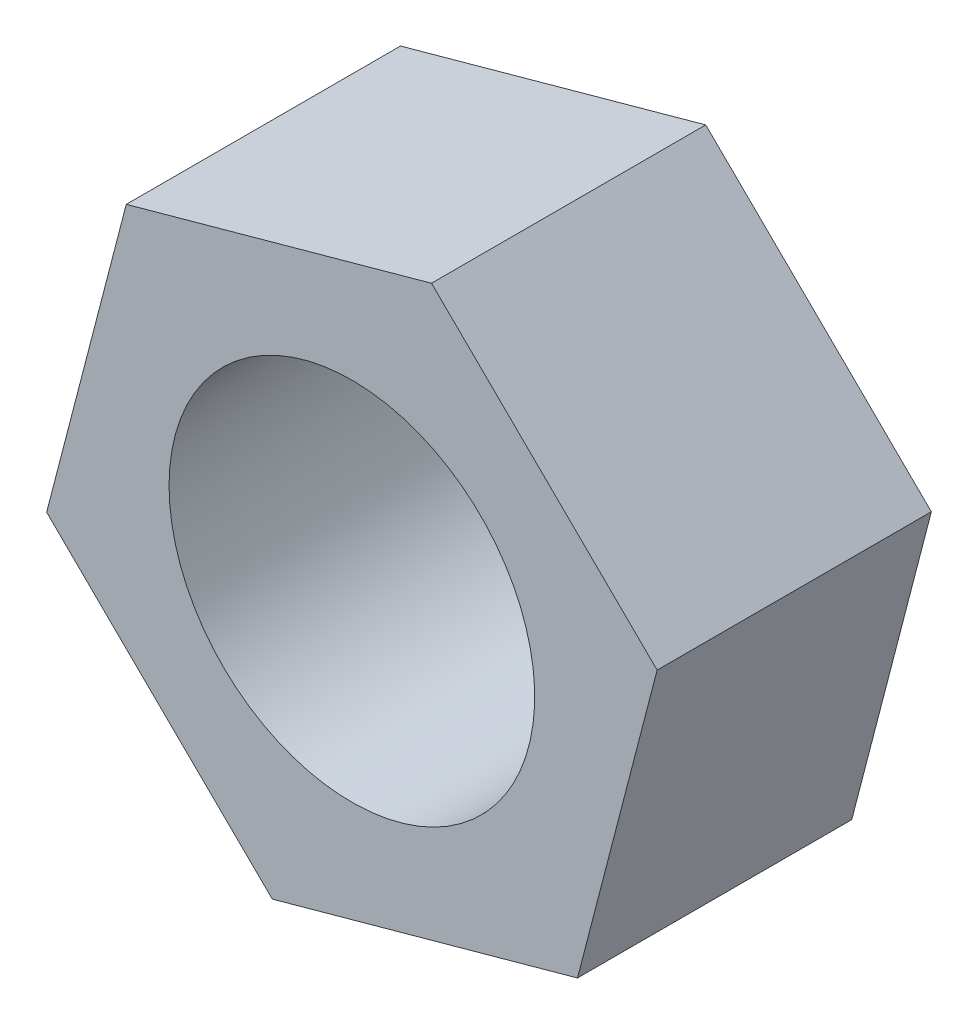
ISO-10303-21;
HEADER;
FILE_DESCRIPTION(('STEP AP214'),'2;1');
FILE_NAME('part.step','',(''),(''),'','','');
FILE_SCHEMA(('AUTOMOTIVE_DESIGN { 1 0 10303 214 1 1 1 1 }'));
ENDSEC;
DATA;
#1=APPLICATION_CONTEXT('core data for automotive mechanical design processes');
#2=APPLICATION_PROTOCOL_DEFINITION('international standard','automotive_design',2000,#1);
#3=PRODUCT_CONTEXT('',#1,'mechanical');
#4=PRODUCT('Part','Part','',(#3));
#5=PRODUCT_RELATED_PRODUCT_CATEGORY('part','',(#4));
#6=PRODUCT_DEFINITION_FORMATION('','',#4);
#7=PRODUCT_DEFINITION_CONTEXT('part definition',#1,'design');
#8=PRODUCT_DEFINITION('design','',#6,#7);
#9=PRODUCT_DEFINITION_SHAPE('','',#8);
#10=(LENGTH_UNIT() NAMED_UNIT(*) SI_UNIT(.MILLI.,.METRE.));
#11=(NAMED_UNIT(*) PLANE_ANGLE_UNIT() SI_UNIT($,.RADIAN.));
#12=(NAMED_UNIT(*) SI_UNIT($,.STERADIAN.) SOLID_ANGLE_UNIT());
#13=UNCERTAINTY_MEASURE_WITH_UNIT(LENGTH_MEASURE(1.E-05),#10,'distance_accuracy_value','');
#14=(GEOMETRIC_REPRESENTATION_CONTEXT(3) GLOBAL_UNCERTAINTY_ASSIGNED_CONTEXT((#13)) GLOBAL_UNIT_ASSIGNED_CONTEXT((#10,
#11,#12)) REPRESENTATION_CONTEXT('',''));
#15=CARTESIAN_POINT('',(0.,0.,0.));
#16=DIRECTION('',(0.,0.,1.));
#17=DIRECTION('',(1.,0.,0.));
#18=AXIS2_PLACEMENT_3D('',#15,#16,#17);
#19=CARTESIAN_POINT('',(-0.871007612450027,-3.35281161699462,3.));
#20=DIRECTION('',(-0.266184769290981,0.963922024127215,0.));
#21=DIRECTION('',(-0.963922024127215,-0.266184769290981,0.));
#22=AXIS2_PLACEMENT_3D('',#19,#20,#21);
#23=PLANE('',#22);
#24=DIRECTION('',(0.963922024127215,0.266184769290981,0.));
#25=VECTOR('',#24,1.);
#26=CARTESIAN_POINT('',(-0.871007612450027,-3.35281161699462,0.));
#27=LINE('',#26,#25);
#28=CARTESIAN_POINT('',(-0.871007612450027,-3.35281161699462,0.));
#29=VERTEX_POINT('',#28);
#30=CARTESIAN_POINT('',(2.46811622819591,-2.43072052776867,0.));
#31=VERTEX_POINT('',#30);
#32=EDGE_CURVE('E121',#29,#31,#27,.T.);
#33=ORIENTED_EDGE('',*,*,#32,.T.);
#34=DIRECTION('',(0.,0.,-1.));
#35=VECTOR('',#34,1.);
#36=CARTESIAN_POINT('',(2.46811622819591,-2.43072052776867,3.));
#37=LINE('',#36,#35);
#38=CARTESIAN_POINT('',(2.46811622819591,-2.43072052776867,3.));
#39=VERTEX_POINT('',#38);
#40=EDGE_CURVE('E11',#39,#31,#37,.T.);
#41=ORIENTED_EDGE('',*,*,#40,.F.);
#42=DIRECTION('',(0.963922024127215,0.266184769290981,0.));
#43=VECTOR('',#42,1.);
#44=CARTESIAN_POINT('',(-0.871007612450027,-3.35281161699462,3.));
#45=LINE('',#44,#43);
#46=CARTESIAN_POINT('',(-0.871007612450027,-3.35281161699462,3.));
#47=VERTEX_POINT('',#46);
#48=EDGE_CURVE('E132',#47,#39,#45,.T.);
#49=ORIENTED_EDGE('',*,*,#48,.F.);
#50=DIRECTION('',(0.,0.,-1.));
#51=VECTOR('',#50,1.);
#52=CARTESIAN_POINT('',(-0.871007612450027,-3.35281161699462,3.));
#53=LINE('',#52,#51);
#54=EDGE_CURVE('E117',#47,#29,#53,.T.);
#55=ORIENTED_EDGE('',*,*,#54,.T.);
#56=EDGE_LOOP('',(#33,#41,#49,#55));
#57=FACE_BOUND('',#56,.T.);
#58=ADVANCED_FACE('F37',(#57),#23,.F.);
#59=CARTESIAN_POINT('',(2.46811622819591,-2.43072052776867,3.));
#60=DIRECTION('',(-0.967873344806975,0.251438239757118,0.));
#61=DIRECTION('',(-0.251438239757118,-0.967873344806975,0.));
#62=AXIS2_PLACEMENT_3D('',#59,#60,#61);
#63=PLANE('',#62);
#64=DIRECTION('',(0.251438239757118,0.967873344806975,0.));
#65=VECTOR('',#64,1.);
#66=CARTESIAN_POINT('',(2.46811622819591,-2.43072052776867,0.));
#67=LINE('',#66,#65);
#68=CARTESIAN_POINT('',(3.33912384064594,0.922091089225958,0.));
#69=VERTEX_POINT('',#68);
#70=EDGE_CURVE('E124',#31,#69,#67,.T.);
#71=ORIENTED_EDGE('',*,*,#70,.T.);
#72=DIRECTION('',(0.,0.,-1.));
#73=VECTOR('',#72,1.);
#74=CARTESIAN_POINT('',(3.33912384064594,0.922091089225958,3.));
#75=LINE('',#74,#73);
#76=CARTESIAN_POINT('',(3.33912384064594,0.922091089225958,3.));
#77=VERTEX_POINT('',#76);
#78=EDGE_CURVE('E45',#77,#69,#75,.T.);
#79=ORIENTED_EDGE('',*,*,#78,.F.);
#80=DIRECTION('',(0.251438239757118,0.967873344806975,0.));
#81=VECTOR('',#80,1.);
#82=CARTESIAN_POINT('',(2.46811622819591,-2.43072052776867,3.));
#83=LINE('',#82,#81);
#84=EDGE_CURVE('E90',#39,#77,#83,.T.);
#85=ORIENTED_EDGE('',*,*,#84,.F.);
#86=ORIENTED_EDGE('',*,*,#40,.T.);
#87=EDGE_LOOP('',(#71,#79,#85,#86));
#88=FACE_BOUND('',#87,.T.);
#89=ADVANCED_FACE('F157',(#88),#63,.F.);
#90=CARTESIAN_POINT('',(3.33912384064594,0.922091089225958,3.));
#91=DIRECTION('',(-0.701688575515994,-0.712483784370097,0.));
#92=DIRECTION('',(0.712483784370097,-0.701688575515994,0.));
#93=AXIS2_PLACEMENT_3D('',#90,#91,#92);
#94=PLANE('',#93);
#95=DIRECTION('',(-0.712483784370097,0.701688575515994,0.));
#96=VECTOR('',#95,1.);
#97=CARTESIAN_POINT('',(3.33912384064594,0.922091089225958,0.));
#98=LINE('',#97,#96);
#99=CARTESIAN_POINT('',(0.871007612450028,3.35281161699462,0.));
#100=VERTEX_POINT('',#99);
#101=EDGE_CURVE('E127',#69,#100,#98,.T.);
#102=ORIENTED_EDGE('',*,*,#101,.T.);
#103=DIRECTION('',(0.,0.,-1.));
#104=VECTOR('',#103,1.);
#105=CARTESIAN_POINT('',(0.871007612450028,3.35281161699462,3.));
#106=LINE('',#105,#104);
#107=CARTESIAN_POINT('',(0.871007612450028,3.35281161699462,3.));
#108=VERTEX_POINT('',#107);
#109=EDGE_CURVE('E112',#108,#100,#106,.T.);
#110=ORIENTED_EDGE('',*,*,#109,.F.);
#111=DIRECTION('',(-0.712483784370097,0.701688575515994,0.));
#112=VECTOR('',#111,1.);
#113=CARTESIAN_POINT('',(3.33912384064594,0.922091089225958,3.));
#114=LINE('',#113,#112);
#115=EDGE_CURVE('E103',#77,#108,#114,.T.);
#116=ORIENTED_EDGE('',*,*,#115,.F.);
#117=ORIENTED_EDGE('',*,*,#78,.T.);
#118=EDGE_LOOP('',(#102,#110,#116,#117));
#119=FACE_BOUND('',#118,.T.);
#120=ADVANCED_FACE('F138',(#119),#94,.F.);
#121=CARTESIAN_POINT('',(0.871007612450028,3.35281161699462,3.));
#122=DIRECTION('',(0.266184769290981,-0.963922024127215,0.));
#123=DIRECTION('',(0.963922024127215,0.266184769290981,0.));
#124=AXIS2_PLACEMENT_3D('',#121,#122,#123);
#125=PLANE('',#124);
#126=DIRECTION('',(-0.963922024127215,-0.266184769290981,0.));
#127=VECTOR('',#126,1.);
#128=CARTESIAN_POINT('',(0.871007612450028,3.35281161699462,0.));
#129=LINE('',#128,#127);
#130=CARTESIAN_POINT('',(-2.46811622819591,2.43072052776867,0.));
#131=VERTEX_POINT('',#130);
#132=EDGE_CURVE('E111',#100,#131,#129,.T.);
#133=ORIENTED_EDGE('',*,*,#132,.T.);
#134=DIRECTION('',(0.,0.,-1.));
#135=VECTOR('',#134,1.);
#136=CARTESIAN_POINT('',(-2.46811622819591,2.43072052776867,3.));
#137=LINE('',#136,#135);
#138=CARTESIAN_POINT('',(-2.46811622819591,2.43072052776867,3.));
#139=VERTEX_POINT('',#138);
#140=EDGE_CURVE('E108',#139,#131,#137,.T.);
#141=ORIENTED_EDGE('',*,*,#140,.F.);
#142=DIRECTION('',(-0.963922024127215,-0.266184769290981,0.));
#143=VECTOR('',#142,1.);
#144=CARTESIAN_POINT('',(0.871007612450028,3.35281161699462,3.));
#145=LINE('',#144,#143);
#146=EDGE_CURVE('E97',#108,#139,#145,.T.);
#147=ORIENTED_EDGE('',*,*,#146,.F.);
#148=ORIENTED_EDGE('',*,*,#109,.T.);
#149=EDGE_LOOP('',(#133,#141,#147,#148));
#150=FACE_BOUND('',#149,.T.);
#151=ADVANCED_FACE('F109',(#150),#125,.F.);
#152=CARTESIAN_POINT('',(-2.46811622819591,2.43072052776867,3.));
#153=DIRECTION('',(0.967873344806975,-0.251438239757118,0.));
#154=DIRECTION('',(0.251438239757118,0.967873344806975,0.));
#155=AXIS2_PLACEMENT_3D('',#152,#153,#154);
#156=PLANE('',#155);
#157=DIRECTION('',(-0.251438239757118,-0.967873344806975,0.));
#158=VECTOR('',#157,1.);
#159=CARTESIAN_POINT('',(-2.46811622819591,2.43072052776867,0.));
#160=LINE('',#159,#158);
#161=CARTESIAN_POINT('',(-3.33912384064594,-0.922091089225957,0.));
#162=VERTEX_POINT('',#161);
#163=EDGE_CURVE('E76',#131,#162,#160,.T.);
#164=ORIENTED_EDGE('',*,*,#163,.T.);
#165=DIRECTION('',(0.,0.,-1.));
#166=VECTOR('',#165,1.);
#167=CARTESIAN_POINT('',(-3.33912384064594,-0.922091089225957,3.));
#168=LINE('',#167,#166);
#169=CARTESIAN_POINT('',(-3.33912384064594,-0.922091089225957,3.));
#170=VERTEX_POINT('',#169);
#171=EDGE_CURVE('E113',#170,#162,#168,.T.);
#172=ORIENTED_EDGE('',*,*,#171,.F.);
#173=DIRECTION('',(-0.251438239757118,-0.967873344806975,0.));
#174=VECTOR('',#173,1.);
#175=CARTESIAN_POINT('',(-2.46811622819591,2.43072052776867,3.));
#176=LINE('',#175,#174);
#177=EDGE_CURVE('E101',#139,#170,#176,.T.);
#178=ORIENTED_EDGE('',*,*,#177,.F.);
#179=ORIENTED_EDGE('',*,*,#140,.T.);
#180=EDGE_LOOP('',(#164,#172,#178,#179));
#181=FACE_BOUND('',#180,.T.);
#182=ADVANCED_FACE('F115',(#181),#156,.F.);
#183=CARTESIAN_POINT('',(-3.33912384064594,-0.922091089225957,3.));
#184=DIRECTION('',(0.701688575515994,0.712483784370097,0.));
#185=DIRECTION('',(-0.712483784370097,0.701688575515995,0.));
#186=AXIS2_PLACEMENT_3D('',#183,#184,#185);
#187=PLANE('',#186);
#188=DIRECTION('',(0.712483784370097,-0.701688575515995,0.));
#189=VECTOR('',#188,1.);
#190=CARTESIAN_POINT('',(-3.33912384064594,-0.922091089225957,0.));
#191=LINE('',#190,#189);
#192=EDGE_CURVE('E82',#162,#29,#191,.T.);
#193=ORIENTED_EDGE('',*,*,#192,.T.);
#194=ORIENTED_EDGE('',*,*,#54,.F.);
#195=DIRECTION('',(0.712483784370097,-0.701688575515995,0.));
#196=VECTOR('',#195,1.);
#197=CARTESIAN_POINT('',(-3.33912384064594,-0.922091089225957,3.));
#198=LINE('',#197,#196);
#199=EDGE_CURVE('E53',#170,#47,#198,.T.);
#200=ORIENTED_EDGE('',*,*,#199,.F.);
#201=ORIENTED_EDGE('',*,*,#171,.T.);
#202=EDGE_LOOP('',(#193,#194,#200,#201));
#203=FACE_BOUND('',#202,.T.);
#204=ADVANCED_FACE('F145',(#203),#187,.F.);
#205=CARTESIAN_POINT('',(0.,0.,3.));
#206=DIRECTION('',(0.,0.,1.));
#207=DIRECTION('',(1.,0.,0.));
#208=AXIS2_PLACEMENT_3D('',#205,#206,#207);
#209=PLANE('',#208);
#210=CARTESIAN_POINT('',(0.,0.,3.));
#211=DIRECTION('',(0.,0.,-1.));
#212=DIRECTION('',(-1.,0.,0.));
#213=AXIS2_PLACEMENT_3D('',#210,#211,#212);
#214=CIRCLE('',#213,2.);
#215=CARTESIAN_POINT('',(-2.,0.,3.));
#216=VERTEX_POINT('',#215);
#217=EDGE_CURVE('E125',#216,#216,#214,.T.);
#218=ORIENTED_EDGE('',*,*,#217,.T.);
#219=EDGE_LOOP('',(#218));
#220=FACE_BOUND('',#219,.T.);
#221=ORIENTED_EDGE('',*,*,#48,.T.);
#222=ORIENTED_EDGE('',*,*,#84,.T.);
#223=ORIENTED_EDGE('',*,*,#115,.T.);
#224=ORIENTED_EDGE('',*,*,#146,.T.);
#225=ORIENTED_EDGE('',*,*,#177,.T.);
#226=ORIENTED_EDGE('',*,*,#199,.T.);
#227=EDGE_LOOP('',(#221,#222,#223,#224,#225,#226));
#228=FACE_BOUND('',#227,.T.);
#229=ADVANCED_FACE('F99',(#220,#228),#209,.T.);
#230=CARTESIAN_POINT('',(0.,0.,0.));
#231=DIRECTION('',(0.,0.,1.));
#232=DIRECTION('',(1.,0.,0.));
#233=AXIS2_PLACEMENT_3D('',#230,#231,#232);
#234=PLANE('',#233);
#235=CARTESIAN_POINT('',(0.,0.,0.));
#236=DIRECTION('',(0.,0.,-1.));
#237=DIRECTION('',(-1.,0.,0.));
#238=AXIS2_PLACEMENT_3D('',#235,#236,#237);
#239=CIRCLE('',#238,2.);
#240=CARTESIAN_POINT('',(-2.,0.,0.));
#241=VERTEX_POINT('',#240);
#242=EDGE_CURVE('E212',#241,#241,#239,.T.);
#243=ORIENTED_EDGE('',*,*,#242,.F.);
#244=EDGE_LOOP('',(#243));
#245=FACE_BOUND('',#244,.T.);
#246=ORIENTED_EDGE('',*,*,#32,.F.);
#247=ORIENTED_EDGE('',*,*,#192,.F.);
#248=ORIENTED_EDGE('',*,*,#163,.F.);
#249=ORIENTED_EDGE('',*,*,#132,.F.);
#250=ORIENTED_EDGE('',*,*,#101,.F.);
#251=ORIENTED_EDGE('',*,*,#70,.F.);
#252=EDGE_LOOP('',(#246,#247,#248,#249,#250,#251));
#253=FACE_BOUND('',#252,.T.);
#254=ADVANCED_FACE('F141',(#245,#253),#234,.F.);
#255=CARTESIAN_POINT('',(0.,0.,3.));
#256=DIRECTION('',(0.,0.,-1.));
#257=DIRECTION('',(-1.,0.,0.));
#258=AXIS2_PLACEMENT_3D('',#255,#256,#257);
#259=CYLINDRICAL_SURFACE('',#258,2.);
#260=ORIENTED_EDGE('',*,*,#217,.F.);
#261=EDGE_LOOP('',(#260));
#262=FACE_BOUND('',#261,.T.);
#263=ORIENTED_EDGE('',*,*,#242,.T.);
#264=EDGE_LOOP('',(#263));
#265=FACE_BOUND('',#264,.T.);
#266=ADVANCED_FACE('F194',(#262,#265),#259,.F.);
#267=CLOSED_SHELL('',(#58,#89,#120,#151,#182,#204,#229,#254,#266));
#268=MANIFOLD_SOLID_BREP('B2',#267);
#269=ADVANCED_BREP_SHAPE_REPRESENTATION('',(#18,#268),#14);
#270=SHAPE_DEFINITION_REPRESENTATION(#9,#269);
ENDSEC;
END-ISO-10303-21;
